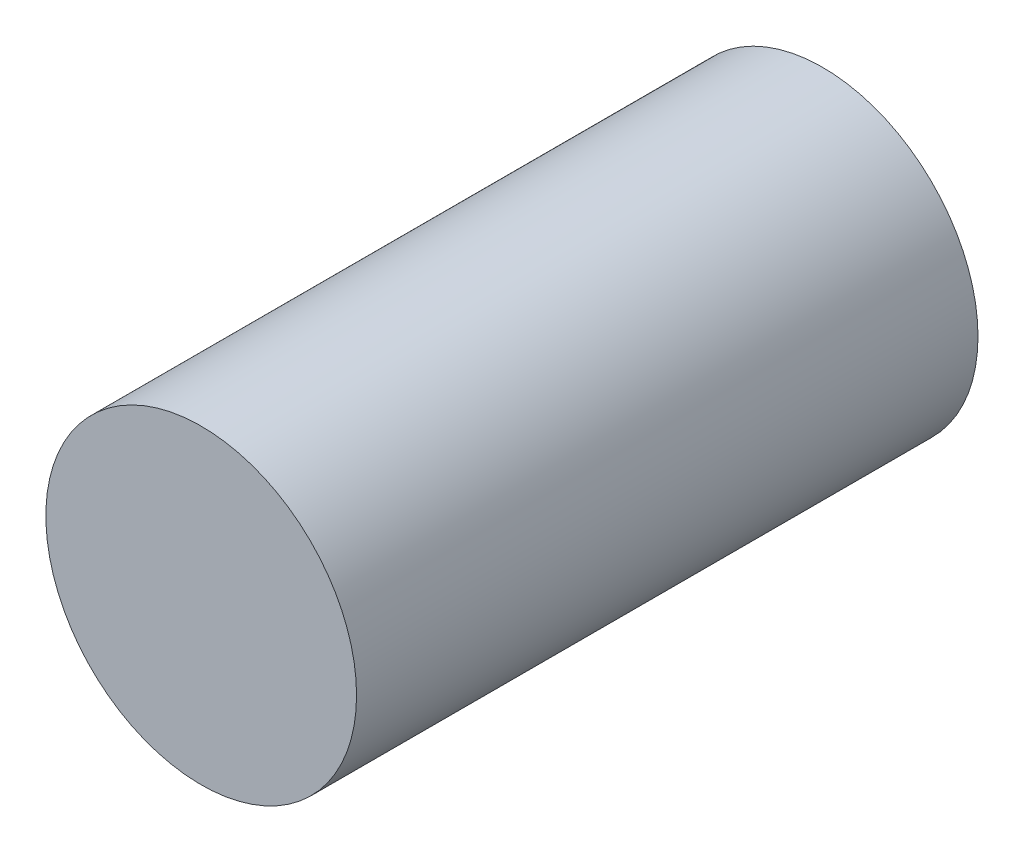
ISO-10303-21;
HEADER;
FILE_DESCRIPTION(('STEP AP214'),'2;1');
FILE_NAME('part.step','',(''),(''),'','','');
FILE_SCHEMA(('AUTOMOTIVE_DESIGN { 1 0 10303 214 1 1 1 1 }'));
ENDSEC;
DATA;
#1=APPLICATION_CONTEXT('core data for automotive mechanical design processes');
#2=APPLICATION_PROTOCOL_DEFINITION('international standard','automotive_design',2000,#1);
#3=PRODUCT_CONTEXT('',#1,'mechanical');
#4=PRODUCT('Part','Part','',(#3));
#5=PRODUCT_RELATED_PRODUCT_CATEGORY('part','',(#4));
#6=PRODUCT_DEFINITION_FORMATION('','',#4);
#7=PRODUCT_DEFINITION_CONTEXT('part definition',#1,'design');
#8=PRODUCT_DEFINITION('design','',#6,#7);
#9=PRODUCT_DEFINITION_SHAPE('','',#8);
#10=(LENGTH_UNIT() NAMED_UNIT(*) SI_UNIT(.MILLI.,.METRE.));
#11=(NAMED_UNIT(*) PLANE_ANGLE_UNIT() SI_UNIT($,.RADIAN.));
#12=(NAMED_UNIT(*) SI_UNIT($,.STERADIAN.) SOLID_ANGLE_UNIT());
#13=UNCERTAINTY_MEASURE_WITH_UNIT(LENGTH_MEASURE(1.E-05),#10,'distance_accuracy_value','');
#14=(GEOMETRIC_REPRESENTATION_CONTEXT(3) GLOBAL_UNCERTAINTY_ASSIGNED_CONTEXT((#13)) GLOBAL_UNIT_ASSIGNED_CONTEXT((#10,
#11,#12)) REPRESENTATION_CONTEXT('',''));
#15=CARTESIAN_POINT('',(0.,0.,0.));
#16=DIRECTION('',(0.,0.,1.));
#17=DIRECTION('',(1.,0.,0.));
#18=AXIS2_PLACEMENT_3D('',#15,#16,#17);
#19=CARTESIAN_POINT('',(0.,0.,200.));
#20=DIRECTION('',(0.,0.,-1.));
#21=DIRECTION('',(-1.,0.,0.));
#22=AXIS2_PLACEMENT_3D('',#19,#20,#21);
#23=CYLINDRICAL_SURFACE('',#22,50.);
#24=CARTESIAN_POINT('',(0.,0.,200.));
#25=DIRECTION('',(0.,0.,1.));
#26=DIRECTION('',(1.,0.,0.));
#27=AXIS2_PLACEMENT_3D('',#24,#25,#26);
#28=CIRCLE('',#27,50.);
#29=CARTESIAN_POINT('',(50.,0.,200.));
#30=VERTEX_POINT('',#29);
#31=EDGE_CURVE('E10',#30,#30,#28,.T.);
#32=ORIENTED_EDGE('',*,*,#31,.F.);
#33=EDGE_LOOP('',(#32));
#34=FACE_BOUND('',#33,.T.);
#35=CARTESIAN_POINT('',(0.,0.,0.));
#36=DIRECTION('',(0.,0.,1.));
#37=DIRECTION('',(1.,0.,0.));
#38=AXIS2_PLACEMENT_3D('',#35,#36,#37);
#39=CIRCLE('',#38,50.);
#40=CARTESIAN_POINT('',(50.,0.,0.));
#41=VERTEX_POINT('',#40);
#42=EDGE_CURVE('E40',#41,#41,#39,.T.);
#43=ORIENTED_EDGE('',*,*,#42,.T.);
#44=EDGE_LOOP('',(#43));
#45=FACE_BOUND('',#44,.T.);
#46=ADVANCED_FACE('F37',(#34,#45),#23,.T.);
#47=CARTESIAN_POINT('',(0.,0.,200.));
#48=DIRECTION('',(0.,0.,1.));
#49=DIRECTION('',(1.,0.,0.));
#50=AXIS2_PLACEMENT_3D('',#47,#48,#49);
#51=PLANE('',#50);
#52=ORIENTED_EDGE('',*,*,#31,.T.);
#53=EDGE_LOOP('',(#52));
#54=FACE_BOUND('',#53,.T.);
#55=ADVANCED_FACE('F52',(#54),#51,.T.);
#56=CARTESIAN_POINT('',(0.,0.,0.));
#57=DIRECTION('',(0.,0.,1.));
#58=DIRECTION('',(1.,0.,0.));
#59=AXIS2_PLACEMENT_3D('',#56,#57,#58);
#60=PLANE('',#59);
#61=ORIENTED_EDGE('',*,*,#42,.F.);
#62=EDGE_LOOP('',(#61));
#63=FACE_BOUND('',#62,.T.);
#64=ADVANCED_FACE('F50',(#63),#60,.F.);
#65=CLOSED_SHELL('',(#46,#55,#64));
#66=MANIFOLD_SOLID_BREP('B2',#65);
#67=ADVANCED_BREP_SHAPE_REPRESENTATION('',(#18,#66),#14);
#68=SHAPE_DEFINITION_REPRESENTATION(#9,#67);
ENDSEC;
END-ISO-10303-21;
